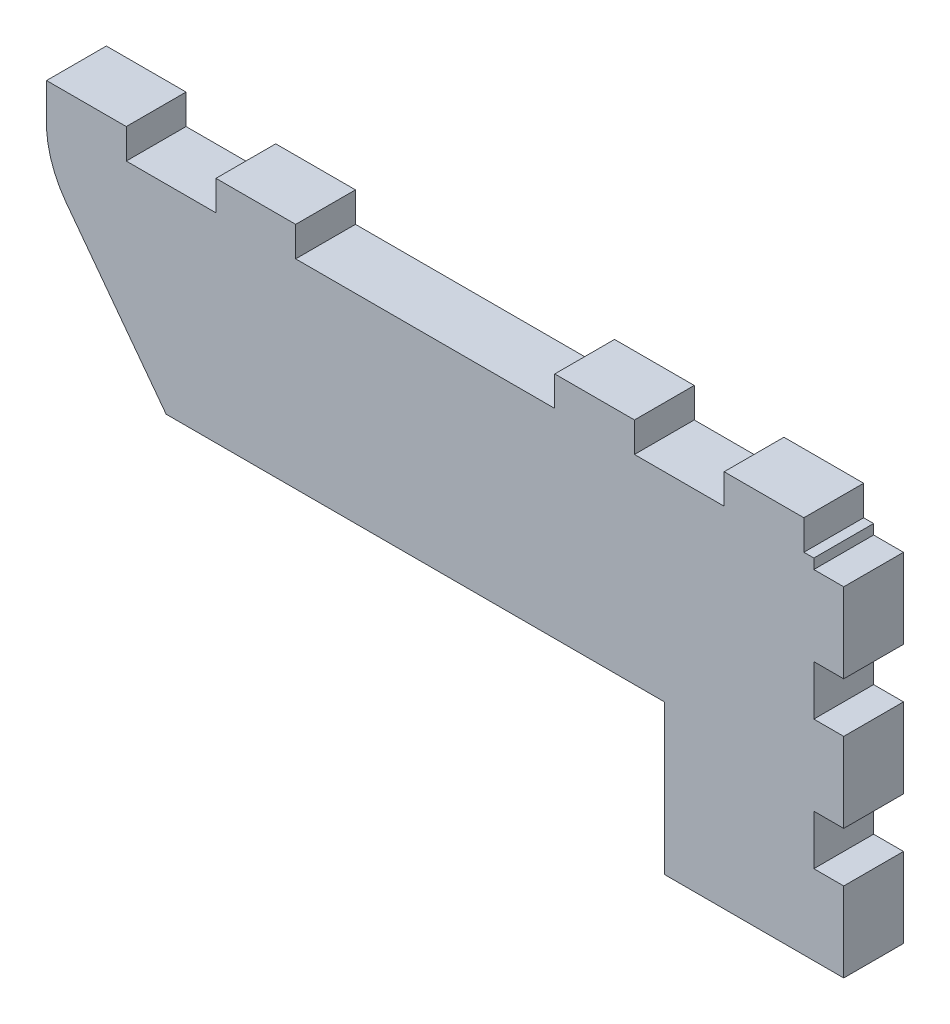
ISO-10303-21;
HEADER;
FILE_DESCRIPTION(('STEP AP214'),'2;1');
FILE_NAME('part.step','',(''),(''),'','','');
FILE_SCHEMA(('AUTOMOTIVE_DESIGN { 1 0 10303 214 1 1 1 1 }'));
ENDSEC;
DATA;
#1=APPLICATION_CONTEXT('core data for automotive mechanical design processes');
#2=APPLICATION_PROTOCOL_DEFINITION('international standard','automotive_design',2000,#1);
#3=PRODUCT_CONTEXT('',#1,'mechanical');
#4=PRODUCT('Part','Part','',(#3));
#5=PRODUCT_RELATED_PRODUCT_CATEGORY('part','',(#4));
#6=PRODUCT_DEFINITION_FORMATION('','',#4);
#7=PRODUCT_DEFINITION_CONTEXT('part definition',#1,'design');
#8=PRODUCT_DEFINITION('design','',#6,#7);
#9=PRODUCT_DEFINITION_SHAPE('','',#8);
#10=(LENGTH_UNIT() NAMED_UNIT(*) SI_UNIT(.MILLI.,.METRE.));
#11=(NAMED_UNIT(*) PLANE_ANGLE_UNIT() SI_UNIT($,.RADIAN.));
#12=(NAMED_UNIT(*) SI_UNIT($,.STERADIAN.) SOLID_ANGLE_UNIT());
#13=UNCERTAINTY_MEASURE_WITH_UNIT(LENGTH_MEASURE(1.E-05),#10,'distance_accuracy_value','');
#14=(GEOMETRIC_REPRESENTATION_CONTEXT(3) GLOBAL_UNCERTAINTY_ASSIGNED_CONTEXT((#13)) GLOBAL_UNIT_ASSIGNED_CONTEXT((#10,
#11,#12)) REPRESENTATION_CONTEXT('',''));
#15=CARTESIAN_POINT('',(0.,0.,0.));
#16=DIRECTION('',(0.,0.,1.));
#17=DIRECTION('',(1.,0.,0.));
#18=AXIS2_PLACEMENT_3D('',#15,#16,#17);
#19=CARTESIAN_POINT('',(0.,0.,6.));
#20=DIRECTION('',(0.,0.,1.));
#21=DIRECTION('',(1.,0.,0.));
#22=AXIS2_PLACEMENT_3D('',#19,#20,#21);
#23=PLANE('',#22);
#24=DIRECTION('',(-1.,0.,0.));
#25=VECTOR('',#24,1.);
#26=CARTESIAN_POINT('',(0.,35.,6.));
#27=LINE('',#26,#25);
#28=CARTESIAN_POINT('',(-26.,35.,6.));
#29=VERTEX_POINT('',#28);
#30=CARTESIAN_POINT('',(-52.,35.,6.));
#31=VERTEX_POINT('',#30);
#32=EDGE_CURVE('E433',#29,#31,#27,.T.);
#33=ORIENTED_EDGE('',*,*,#32,.T.);
#34=DIRECTION('',(0.,1.,0.));
#35=VECTOR('',#34,1.);
#36=CARTESIAN_POINT('',(-52.,0.,6.));
#37=LINE('',#36,#35);
#38=CARTESIAN_POINT('',(-52.,38.,6.));
#39=VERTEX_POINT('',#38);
#40=EDGE_CURVE('E622',#31,#39,#37,.T.);
#41=ORIENTED_EDGE('',*,*,#40,.T.);
#42=DIRECTION('',(1.,0.,0.));
#43=VECTOR('',#42,1.);
#44=CARTESIAN_POINT('',(0.,38.,6.));
#45=LINE('',#44,#43);
#46=CARTESIAN_POINT('',(-60.,38.,6.));
#47=VERTEX_POINT('',#46);
#48=EDGE_CURVE('E638',#47,#39,#45,.T.);
#49=ORIENTED_EDGE('',*,*,#48,.F.);
#50=DIRECTION('',(0.,1.,0.));
#51=VECTOR('',#50,1.);
#52=CARTESIAN_POINT('',(-60.,0.,6.));
#53=LINE('',#52,#51);
#54=CARTESIAN_POINT('',(-60.,35.,6.));
#55=VERTEX_POINT('',#54);
#56=EDGE_CURVE('E432',#55,#47,#53,.T.);
#57=ORIENTED_EDGE('',*,*,#56,.F.);
#58=CARTESIAN_POINT('',(-69.,35.,6.));
#59=VERTEX_POINT('',#58);
#60=EDGE_CURVE('E375',#55,#59,#27,.T.);
#61=ORIENTED_EDGE('',*,*,#60,.T.);
#62=DIRECTION('',(0.,1.,0.));
#63=VECTOR('',#62,1.);
#64=CARTESIAN_POINT('',(-69.,35.,6.));
#65=LINE('',#64,#63);
#66=CARTESIAN_POINT('',(-69.,38.,6.));
#67=VERTEX_POINT('',#66);
#68=EDGE_CURVE('E393',#59,#67,#65,.T.);
#69=ORIENTED_EDGE('',*,*,#68,.T.);
#70=DIRECTION('',(1.,0.,0.));
#71=VECTOR('',#70,1.);
#72=CARTESIAN_POINT('',(-77.,38.,6.));
#73=LINE('',#72,#71);
#74=CARTESIAN_POINT('',(-77.,38.,6.));
#75=VERTEX_POINT('',#74);
#76=EDGE_CURVE('E390',#75,#67,#73,.T.);
#77=ORIENTED_EDGE('',*,*,#76,.F.);
#78=DIRECTION('',(0.,1.,0.));
#79=VECTOR('',#78,1.);
#80=CARTESIAN_POINT('',(-77.,35.,6.));
#81=LINE('',#80,#79);
#82=CARTESIAN_POINT('',(-77.,35.,6.));
#83=VERTEX_POINT('',#82);
#84=EDGE_CURVE('E396',#83,#75,#81,.T.);
#85=ORIENTED_EDGE('',*,*,#84,.F.);
#86=CARTESIAN_POINT('',(-67.0204615657747,34.360615421033,6.));
#87=DIRECTION('',(0.,0.,1.));
#88=DIRECTION('',(1.,0.,0.));
#89=AXIS2_PLACEMENT_3D('',#86,#87,#88);
#90=CIRCLE('',#89,10.);
#91=CARTESIAN_POINT('',(-75.0204615657747,28.360615421033,6.));
#92=VERTEX_POINT('',#91);
#93=EDGE_CURVE('E12',#83,#92,#90,.T.);
#94=ORIENTED_EDGE('',*,*,#93,.T.);
#95=DIRECTION('',(0.6,-0.8,0.));
#96=VECTOR('',#95,1.);
#97=CARTESIAN_POINT('',(-34.4,-25.8,6.));
#98=LINE('',#97,#96);
#99=CARTESIAN_POINT('',(-65.,15.,6.));
#100=VERTEX_POINT('',#99);
#101=EDGE_CURVE('E424',#92,#100,#98,.T.);
#102=ORIENTED_EDGE('',*,*,#101,.T.);
#103=DIRECTION('',(1.,0.,0.));
#104=VECTOR('',#103,1.);
#105=CARTESIAN_POINT('',(0.,15.,6.));
#106=LINE('',#105,#104);
#107=CARTESIAN_POINT('',(-15.,15.,6.));
#108=VERTEX_POINT('',#107);
#109=EDGE_CURVE('E427',#100,#108,#106,.T.);
#110=ORIENTED_EDGE('',*,*,#109,.T.);
#111=DIRECTION('',(0.,1.,0.));
#112=VECTOR('',#111,1.);
#113=CARTESIAN_POINT('',(-15.,0.,6.));
#114=LINE('',#113,#112);
#115=CARTESIAN_POINT('',(-15.,0.,6.));
#116=VERTEX_POINT('',#115);
#117=EDGE_CURVE('E429',#116,#108,#114,.T.);
#118=ORIENTED_EDGE('',*,*,#117,.F.);
#119=DIRECTION('',(-1.,0.,0.));
#120=VECTOR('',#119,1.);
#121=CARTESIAN_POINT('',(0.,0.,6.));
#122=LINE('',#121,#120);
#123=CARTESIAN_POINT('',(3.,0.,6.));
#124=VERTEX_POINT('',#123);
#125=EDGE_CURVE('E439',#124,#116,#122,.T.);
#126=ORIENTED_EDGE('',*,*,#125,.F.);
#127=DIRECTION('',(0.,-1.,0.));
#128=VECTOR('',#127,1.);
#129=CARTESIAN_POINT('',(3.,0.,6.));
#130=LINE('',#129,#128);
#131=CARTESIAN_POINT('',(3.,8.,6.));
#132=VERTEX_POINT('',#131);
#133=EDGE_CURVE('E442',#132,#124,#130,.T.);
#134=ORIENTED_EDGE('',*,*,#133,.F.);
#135=DIRECTION('',(1.,0.,0.));
#136=VECTOR('',#135,1.);
#137=CARTESIAN_POINT('',(0.,8.,6.));
#138=LINE('',#137,#136);
#139=CARTESIAN_POINT('',(0.,8.,6.));
#140=VERTEX_POINT('',#139);
#141=EDGE_CURVE('E445',#140,#132,#138,.T.);
#142=ORIENTED_EDGE('',*,*,#141,.F.);
#143=DIRECTION('',(0.,1.,0.));
#144=VECTOR('',#143,1.);
#145=CARTESIAN_POINT('',(0.,0.,6.));
#146=LINE('',#145,#144);
#147=CARTESIAN_POINT('',(0.,13.,6.));
#148=VERTEX_POINT('',#147);
#149=EDGE_CURVE('E448',#140,#148,#146,.T.);
#150=ORIENTED_EDGE('',*,*,#149,.T.);
#151=DIRECTION('',(1.,0.,0.));
#152=VECTOR('',#151,1.);
#153=CARTESIAN_POINT('',(0.,13.,6.));
#154=LINE('',#153,#152);
#155=CARTESIAN_POINT('',(3.,13.,6.));
#156=VERTEX_POINT('',#155);
#157=EDGE_CURVE('E450',#148,#156,#154,.T.);
#158=ORIENTED_EDGE('',*,*,#157,.T.);
#159=DIRECTION('',(0.,-1.,0.));
#160=VECTOR('',#159,1.);
#161=CARTESIAN_POINT('',(3.,0.,6.));
#162=LINE('',#161,#160);
#163=CARTESIAN_POINT('',(3.,21.,6.));
#164=VERTEX_POINT('',#163);
#165=EDGE_CURVE('E453',#164,#156,#162,.T.);
#166=ORIENTED_EDGE('',*,*,#165,.F.);
#167=DIRECTION('',(1.,0.,0.));
#168=VECTOR('',#167,1.);
#169=CARTESIAN_POINT('',(0.,21.,6.));
#170=LINE('',#169,#168);
#171=CARTESIAN_POINT('',(0.,21.,6.));
#172=VERTEX_POINT('',#171);
#173=EDGE_CURVE('E456',#172,#164,#170,.T.);
#174=ORIENTED_EDGE('',*,*,#173,.F.);
#175=CARTESIAN_POINT('',(0.,26.,6.));
#176=VERTEX_POINT('',#175);
#177=EDGE_CURVE('E451',#172,#176,#146,.T.);
#178=ORIENTED_EDGE('',*,*,#177,.T.);
#179=DIRECTION('',(1.,0.,0.));
#180=VECTOR('',#179,1.);
#181=CARTESIAN_POINT('',(0.,26.,6.));
#182=LINE('',#181,#180);
#183=CARTESIAN_POINT('',(3.,26.,6.));
#184=VERTEX_POINT('',#183);
#185=EDGE_CURVE('E459',#176,#184,#182,.T.);
#186=ORIENTED_EDGE('',*,*,#185,.T.);
#187=DIRECTION('',(0.,-1.,0.));
#188=VECTOR('',#187,1.);
#189=CARTESIAN_POINT('',(3.,0.,6.));
#190=LINE('',#189,#188);
#191=CARTESIAN_POINT('',(3.,34.,6.));
#192=VERTEX_POINT('',#191);
#193=EDGE_CURVE('E461',#192,#184,#190,.T.);
#194=ORIENTED_EDGE('',*,*,#193,.F.);
#195=DIRECTION('',(1.,0.,0.));
#196=VECTOR('',#195,1.);
#197=CARTESIAN_POINT('',(0.,34.,6.));
#198=LINE('',#197,#196);
#199=CARTESIAN_POINT('',(0.,34.,6.));
#200=VERTEX_POINT('',#199);
#201=EDGE_CURVE('E464',#200,#192,#198,.T.);
#202=ORIENTED_EDGE('',*,*,#201,.F.);
#203=CARTESIAN_POINT('',(0.,35.,6.));
#204=VERTEX_POINT('',#203);
#205=EDGE_CURVE('E369',#200,#204,#146,.T.);
#206=ORIENTED_EDGE('',*,*,#205,.T.);
#207=CARTESIAN_POINT('',(-1.00000000000003,35.,6.));
#208=VERTEX_POINT('',#207);
#209=EDGE_CURVE('E364',#204,#208,#27,.T.);
#210=ORIENTED_EDGE('',*,*,#209,.T.);
#211=DIRECTION('',(0.,1.,0.));
#212=VECTOR('',#211,1.);
#213=CARTESIAN_POINT('',(-1.00000000000003,0.,6.));
#214=LINE('',#213,#212);
#215=CARTESIAN_POINT('',(-1.00000000000003,38.,6.));
#216=VERTEX_POINT('',#215);
#217=EDGE_CURVE('E353',#208,#216,#214,.T.);
#218=ORIENTED_EDGE('',*,*,#217,.T.);
#219=DIRECTION('',(1.,0.,0.));
#220=VECTOR('',#219,1.);
#221=CARTESIAN_POINT('',(0.,38.,6.));
#222=LINE('',#221,#220);
#223=CARTESIAN_POINT('',(-9.00000000000002,38.,6.));
#224=VERTEX_POINT('',#223);
#225=EDGE_CURVE('E363',#224,#216,#222,.T.);
#226=ORIENTED_EDGE('',*,*,#225,.F.);
#227=DIRECTION('',(0.,1.,0.));
#228=VECTOR('',#227,1.);
#229=CARTESIAN_POINT('',(-9.00000000000002,0.,6.));
#230=LINE('',#229,#228);
#231=CARTESIAN_POINT('',(-9.00000000000002,35.,6.));
#232=VERTEX_POINT('',#231);
#233=EDGE_CURVE('E591',#232,#224,#230,.T.);
#234=ORIENTED_EDGE('',*,*,#233,.F.);
#235=CARTESIAN_POINT('',(-18.,35.,6.));
#236=VERTEX_POINT('',#235);
#237=EDGE_CURVE('E376',#232,#236,#27,.T.);
#238=ORIENTED_EDGE('',*,*,#237,.T.);
#239=DIRECTION('',(0.,1.,0.));
#240=VECTOR('',#239,1.);
#241=CARTESIAN_POINT('',(-18.,0.,6.));
#242=LINE('',#241,#240);
#243=CARTESIAN_POINT('',(-18.,38.,6.));
#244=VERTEX_POINT('',#243);
#245=EDGE_CURVE('E634',#236,#244,#242,.T.);
#246=ORIENTED_EDGE('',*,*,#245,.T.);
#247=DIRECTION('',(1.,0.,0.));
#248=VECTOR('',#247,1.);
#249=CARTESIAN_POINT('',(0.,38.,6.));
#250=LINE('',#249,#248);
#251=CARTESIAN_POINT('',(-26.,38.,6.));
#252=VERTEX_POINT('',#251);
#253=EDGE_CURVE('E631',#252,#244,#250,.T.);
#254=ORIENTED_EDGE('',*,*,#253,.F.);
#255=DIRECTION('',(0.,1.,0.));
#256=VECTOR('',#255,1.);
#257=CARTESIAN_POINT('',(-26.,0.,6.));
#258=LINE('',#257,#256);
#259=EDGE_CURVE('E627',#29,#252,#258,.T.);
#260=ORIENTED_EDGE('',*,*,#259,.F.);
#261=EDGE_LOOP('',(#33,#41,#49,#57,#61,#69,#77,#85,#94,#102,#110,#118,#126,#134,#142,#150,#158,
#166,#174,#178,#186,#194,#202,#206,#210,#218,#226,#234,#238,#246,#254,#260));
#262=FACE_BOUND('',#261,.T.);
#263=ADVANCED_FACE('F145',(#262),#23,.T.);
#264=CARTESIAN_POINT('',(0.,0.,0.));
#265=DIRECTION('',(0.,0.,1.));
#266=DIRECTION('',(1.,0.,0.));
#267=AXIS2_PLACEMENT_3D('',#264,#265,#266);
#268=PLANE('',#267);
#269=DIRECTION('',(-1.,0.,0.));
#270=VECTOR('',#269,1.);
#271=CARTESIAN_POINT('',(0.,35.,0.));
#272=LINE('',#271,#270);
#273=CARTESIAN_POINT('',(-26.,35.,0.));
#274=VERTEX_POINT('',#273);
#275=CARTESIAN_POINT('',(-52.,35.,0.));
#276=VERTEX_POINT('',#275);
#277=EDGE_CURVE('E487',#274,#276,#272,.T.);
#278=ORIENTED_EDGE('',*,*,#277,.F.);
#279=DIRECTION('',(0.,1.,0.));
#280=VECTOR('',#279,1.);
#281=CARTESIAN_POINT('',(-26.,0.,0.));
#282=LINE('',#281,#280);
#283=CARTESIAN_POINT('',(-26.,38.,0.));
#284=VERTEX_POINT('',#283);
#285=EDGE_CURVE('E484',#274,#284,#282,.T.);
#286=ORIENTED_EDGE('',*,*,#285,.T.);
#287=DIRECTION('',(1.,0.,0.));
#288=VECTOR('',#287,1.);
#289=CARTESIAN_POINT('',(0.,38.,0.));
#290=LINE('',#289,#288);
#291=CARTESIAN_POINT('',(-18.,38.,0.));
#292=VERTEX_POINT('',#291);
#293=EDGE_CURVE('E481',#284,#292,#290,.T.);
#294=ORIENTED_EDGE('',*,*,#293,.T.);
#295=DIRECTION('',(0.,1.,0.));
#296=VECTOR('',#295,1.);
#297=CARTESIAN_POINT('',(-18.,0.,0.));
#298=LINE('',#297,#296);
#299=CARTESIAN_POINT('',(-18.,35.,0.));
#300=VERTEX_POINT('',#299);
#301=EDGE_CURVE('E478',#300,#292,#298,.T.);
#302=ORIENTED_EDGE('',*,*,#301,.F.);
#303=CARTESIAN_POINT('',(-9.00000000000002,35.,0.));
#304=VERTEX_POINT('',#303);
#305=EDGE_CURVE('E470',#304,#300,#272,.T.);
#306=ORIENTED_EDGE('',*,*,#305,.F.);
#307=DIRECTION('',(0.,1.,0.));
#308=VECTOR('',#307,1.);
#309=CARTESIAN_POINT('',(-9.00000000000002,0.,0.));
#310=LINE('',#309,#308);
#311=CARTESIAN_POINT('',(-9.00000000000002,38.,0.));
#312=VERTEX_POINT('',#311);
#313=EDGE_CURVE('E475',#304,#312,#310,.T.);
#314=ORIENTED_EDGE('',*,*,#313,.T.);
#315=DIRECTION('',(1.,0.,0.));
#316=VECTOR('',#315,1.);
#317=CARTESIAN_POINT('',(0.,38.,0.));
#318=LINE('',#317,#316);
#319=CARTESIAN_POINT('',(-1.00000000000003,38.,0.));
#320=VERTEX_POINT('',#319);
#321=EDGE_CURVE('E472',#312,#320,#318,.T.);
#322=ORIENTED_EDGE('',*,*,#321,.T.);
#323=DIRECTION('',(0.,1.,0.));
#324=VECTOR('',#323,1.);
#325=CARTESIAN_POINT('',(-1.00000000000003,0.,0.));
#326=LINE('',#325,#324);
#327=CARTESIAN_POINT('',(-1.00000000000003,35.,0.));
#328=VERTEX_POINT('',#327);
#329=EDGE_CURVE('E468',#328,#320,#326,.T.);
#330=ORIENTED_EDGE('',*,*,#329,.F.);
#331=CARTESIAN_POINT('',(0.,35.,0.));
#332=VERTEX_POINT('',#331);
#333=EDGE_CURVE('E379',#332,#328,#272,.T.);
#334=ORIENTED_EDGE('',*,*,#333,.F.);
#335=DIRECTION('',(0.,1.,0.));
#336=VECTOR('',#335,1.);
#337=CARTESIAN_POINT('',(0.,0.,0.));
#338=LINE('',#337,#336);
#339=CARTESIAN_POINT('',(0.,34.,0.));
#340=VERTEX_POINT('',#339);
#341=EDGE_CURVE('E373',#340,#332,#338,.T.);
#342=ORIENTED_EDGE('',*,*,#341,.F.);
#343=DIRECTION('',(1.,0.,0.));
#344=VECTOR('',#343,1.);
#345=CARTESIAN_POINT('',(0.,34.,0.));
#346=LINE('',#345,#344);
#347=CARTESIAN_POINT('',(3.,34.,0.));
#348=VERTEX_POINT('',#347);
#349=EDGE_CURVE('E531',#340,#348,#346,.T.);
#350=ORIENTED_EDGE('',*,*,#349,.T.);
#351=DIRECTION('',(0.,-1.,0.));
#352=VECTOR('',#351,1.);
#353=CARTESIAN_POINT('',(3.,0.,0.));
#354=LINE('',#353,#352);
#355=CARTESIAN_POINT('',(3.,26.,0.));
#356=VERTEX_POINT('',#355);
#357=EDGE_CURVE('E528',#348,#356,#354,.T.);
#358=ORIENTED_EDGE('',*,*,#357,.T.);
#359=DIRECTION('',(1.,0.,0.));
#360=VECTOR('',#359,1.);
#361=CARTESIAN_POINT('',(0.,26.,0.));
#362=LINE('',#361,#360);
#363=CARTESIAN_POINT('',(0.,26.,0.));
#364=VERTEX_POINT('',#363);
#365=EDGE_CURVE('E525',#364,#356,#362,.T.);
#366=ORIENTED_EDGE('',*,*,#365,.F.);
#367=CARTESIAN_POINT('',(0.,21.,0.));
#368=VERTEX_POINT('',#367);
#369=EDGE_CURVE('E516',#368,#364,#338,.T.);
#370=ORIENTED_EDGE('',*,*,#369,.F.);
#371=DIRECTION('',(1.,0.,0.));
#372=VECTOR('',#371,1.);
#373=CARTESIAN_POINT('',(0.,21.,0.));
#374=LINE('',#373,#372);
#375=CARTESIAN_POINT('',(3.,21.,0.));
#376=VERTEX_POINT('',#375);
#377=EDGE_CURVE('E522',#368,#376,#374,.T.);
#378=ORIENTED_EDGE('',*,*,#377,.T.);
#379=DIRECTION('',(0.,-1.,0.));
#380=VECTOR('',#379,1.);
#381=CARTESIAN_POINT('',(3.,0.,0.));
#382=LINE('',#381,#380);
#383=CARTESIAN_POINT('',(3.,13.,0.));
#384=VERTEX_POINT('',#383);
#385=EDGE_CURVE('E519',#376,#384,#382,.T.);
#386=ORIENTED_EDGE('',*,*,#385,.T.);
#387=DIRECTION('',(1.,0.,0.));
#388=VECTOR('',#387,1.);
#389=CARTESIAN_POINT('',(0.,13.,0.));
#390=LINE('',#389,#388);
#391=CARTESIAN_POINT('',(0.,13.,0.));
#392=VERTEX_POINT('',#391);
#393=EDGE_CURVE('E515',#392,#384,#390,.T.);
#394=ORIENTED_EDGE('',*,*,#393,.F.);
#395=CARTESIAN_POINT('',(0.,8.,0.));
#396=VERTEX_POINT('',#395);
#397=EDGE_CURVE('E513',#396,#392,#338,.T.);
#398=ORIENTED_EDGE('',*,*,#397,.F.);
#399=DIRECTION('',(1.,0.,0.));
#400=VECTOR('',#399,1.);
#401=CARTESIAN_POINT('',(0.,8.,0.));
#402=LINE('',#401,#400);
#403=CARTESIAN_POINT('',(3.,8.,0.));
#404=VERTEX_POINT('',#403);
#405=EDGE_CURVE('E510',#396,#404,#402,.T.);
#406=ORIENTED_EDGE('',*,*,#405,.T.);
#407=DIRECTION('',(0.,-1.,0.));
#408=VECTOR('',#407,1.);
#409=CARTESIAN_POINT('',(3.,0.,0.));
#410=LINE('',#409,#408);
#411=CARTESIAN_POINT('',(3.,0.,0.));
#412=VERTEX_POINT('',#411);
#413=EDGE_CURVE('E507',#404,#412,#410,.T.);
#414=ORIENTED_EDGE('',*,*,#413,.T.);
#415=DIRECTION('',(-1.,0.,0.));
#416=VECTOR('',#415,1.);
#417=CARTESIAN_POINT('',(0.,0.,0.));
#418=LINE('',#417,#416);
#419=CARTESIAN_POINT('',(-15.,0.,0.));
#420=VERTEX_POINT('',#419);
#421=EDGE_CURVE('E504',#412,#420,#418,.T.);
#422=ORIENTED_EDGE('',*,*,#421,.T.);
#423=DIRECTION('',(0.,1.,0.));
#424=VECTOR('',#423,1.);
#425=CARTESIAN_POINT('',(-15.,0.,0.));
#426=LINE('',#425,#424);
#427=CARTESIAN_POINT('',(-15.,15.,0.));
#428=VERTEX_POINT('',#427);
#429=EDGE_CURVE('E501',#420,#428,#426,.T.);
#430=ORIENTED_EDGE('',*,*,#429,.T.);
#431=DIRECTION('',(1.,0.,0.));
#432=VECTOR('',#431,1.);
#433=CARTESIAN_POINT('',(0.,15.,0.));
#434=LINE('',#433,#432);
#435=CARTESIAN_POINT('',(-65.,15.,0.));
#436=VERTEX_POINT('',#435);
#437=EDGE_CURVE('E498',#436,#428,#434,.T.);
#438=ORIENTED_EDGE('',*,*,#437,.F.);
#439=DIRECTION('',(0.6,-0.8,0.));
#440=VECTOR('',#439,1.);
#441=CARTESIAN_POINT('',(-34.4,-25.8,0.));
#442=LINE('',#441,#440);
#443=CARTESIAN_POINT('',(-75.0204615657747,28.360615421033,0.));
#444=VERTEX_POINT('',#443);
#445=EDGE_CURVE('E416',#444,#436,#442,.T.);
#446=ORIENTED_EDGE('',*,*,#445,.F.);
#447=CARTESIAN_POINT('',(-67.0204615657747,34.360615421033,0.));
#448=DIRECTION('',(0.,0.,1.));
#449=DIRECTION('',(1.,0.,0.));
#450=AXIS2_PLACEMENT_3D('',#447,#448,#449);
#451=CIRCLE('',#450,10.);
#452=CARTESIAN_POINT('',(-77.,35.,0.));
#453=VERTEX_POINT('',#452);
#454=EDGE_CURVE('E153',#444,#453,#451,.F.);
#455=ORIENTED_EDGE('',*,*,#454,.T.);
#456=DIRECTION('',(0.,1.,0.));
#457=VECTOR('',#456,1.);
#458=CARTESIAN_POINT('',(-77.,35.,0.));
#459=LINE('',#458,#457);
#460=CARTESIAN_POINT('',(-77.,38.,0.));
#461=VERTEX_POINT('',#460);
#462=EDGE_CURVE('E394',#453,#461,#459,.T.);
#463=ORIENTED_EDGE('',*,*,#462,.T.);
#464=DIRECTION('',(1.,0.,0.));
#465=VECTOR('',#464,1.);
#466=CARTESIAN_POINT('',(-77.,38.,0.));
#467=LINE('',#466,#465);
#468=CARTESIAN_POINT('',(-69.,38.,0.));
#469=VERTEX_POINT('',#468);
#470=EDGE_CURVE('E400',#461,#469,#467,.T.);
#471=ORIENTED_EDGE('',*,*,#470,.T.);
#472=DIRECTION('',(0.,1.,0.));
#473=VECTOR('',#472,1.);
#474=CARTESIAN_POINT('',(-69.,35.,0.));
#475=LINE('',#474,#473);
#476=CARTESIAN_POINT('',(-69.,35.,0.));
#477=VERTEX_POINT('',#476);
#478=EDGE_CURVE('E403',#477,#469,#475,.T.);
#479=ORIENTED_EDGE('',*,*,#478,.F.);
#480=CARTESIAN_POINT('',(-60.,35.,0.));
#481=VERTEX_POINT('',#480);
#482=EDGE_CURVE('E469',#481,#477,#272,.T.);
#483=ORIENTED_EDGE('',*,*,#482,.F.);
#484=DIRECTION('',(0.,1.,0.));
#485=VECTOR('',#484,1.);
#486=CARTESIAN_POINT('',(-60.,0.,0.));
#487=LINE('',#486,#485);
#488=CARTESIAN_POINT('',(-60.,38.,0.));
#489=VERTEX_POINT('',#488);
#490=EDGE_CURVE('E494',#481,#489,#487,.T.);
#491=ORIENTED_EDGE('',*,*,#490,.T.);
#492=DIRECTION('',(1.,0.,0.));
#493=VECTOR('',#492,1.);
#494=CARTESIAN_POINT('',(0.,38.,0.));
#495=LINE('',#494,#493);
#496=CARTESIAN_POINT('',(-52.,38.,0.));
#497=VERTEX_POINT('',#496);
#498=EDGE_CURVE('E491',#489,#497,#495,.T.);
#499=ORIENTED_EDGE('',*,*,#498,.T.);
#500=DIRECTION('',(0.,1.,0.));
#501=VECTOR('',#500,1.);
#502=CARTESIAN_POINT('',(-52.,0.,0.));
#503=LINE('',#502,#501);
#504=EDGE_CURVE('E488',#276,#497,#503,.T.);
#505=ORIENTED_EDGE('',*,*,#504,.F.);
#506=EDGE_LOOP('',(#278,#286,#294,#302,#306,#314,#322,#330,#334,#342,#350,#358,#366,#370,#378,
#386,#394,#398,#406,#414,#422,#430,#438,#446,#455,#463,#471,#479,#483,#491,#499,#505));
#507=FACE_BOUND('',#506,.T.);
#508=ADVANCED_FACE('F414',(#507),#268,.F.);
#509=CARTESIAN_POINT('',(0.,35.,6.));
#510=DIRECTION('',(0.,-1.,0.));
#511=DIRECTION('',(1.,0.,0.));
#512=AXIS2_PLACEMENT_3D('',#509,#510,#511);
#513=PLANE('',#512);
#514=DIRECTION('',(0.,0.,-1.));
#515=VECTOR('',#514,1.);
#516=CARTESIAN_POINT('',(-69.,35.,6.));
#517=LINE('',#516,#515);
#518=EDGE_CURVE('E380',#59,#477,#517,.T.);
#519=ORIENTED_EDGE('',*,*,#518,.F.);
#520=ORIENTED_EDGE('',*,*,#60,.F.);
#521=DIRECTION('',(0.,0.,-1.));
#522=VECTOR('',#521,1.);
#523=CARTESIAN_POINT('',(-60.,35.,6.));
#524=LINE('',#523,#522);
#525=EDGE_CURVE('E565',#55,#481,#524,.T.);
#526=ORIENTED_EDGE('',*,*,#525,.T.);
#527=ORIENTED_EDGE('',*,*,#482,.T.);
#528=EDGE_LOOP('',(#519,#520,#526,#527));
#529=FACE_BOUND('',#528,.T.);
#530=ADVANCED_FACE('F603',(#529),#513,.F.);
#531=ORIENTED_EDGE('',*,*,#333,.T.);
#532=DIRECTION('',(0.,0.,-1.));
#533=VECTOR('',#532,1.);
#534=CARTESIAN_POINT('',(-1.00000000000003,35.,6.));
#535=LINE('',#534,#533);
#536=EDGE_CURVE('E358',#208,#328,#535,.T.);
#537=ORIENTED_EDGE('',*,*,#536,.F.);
#538=ORIENTED_EDGE('',*,*,#209,.F.);
#539=DIRECTION('',(0.,0.,-1.));
#540=VECTOR('',#539,1.);
#541=CARTESIAN_POINT('',(0.,35.,6.));
#542=LINE('',#541,#540);
#543=EDGE_CURVE('E534',#204,#332,#542,.T.);
#544=ORIENTED_EDGE('',*,*,#543,.T.);
#545=EDGE_LOOP('',(#531,#537,#538,#544));
#546=FACE_BOUND('',#545,.T.);
#547=ADVANCED_FACE('F377',(#546),#513,.F.);
#548=CARTESIAN_POINT('',(-1.00000000000003,0.,6.));
#549=DIRECTION('',(-1.,0.,0.));
#550=DIRECTION('',(0.,0.,1.));
#551=AXIS2_PLACEMENT_3D('',#548,#549,#550);
#552=PLANE('',#551);
#553=ORIENTED_EDGE('',*,*,#329,.T.);
#554=DIRECTION('',(0.,0.,-1.));
#555=VECTOR('',#554,1.);
#556=CARTESIAN_POINT('',(-1.00000000000003,38.,6.));
#557=LINE('',#556,#555);
#558=EDGE_CURVE('E360',#216,#320,#557,.T.);
#559=ORIENTED_EDGE('',*,*,#558,.F.);
#560=ORIENTED_EDGE('',*,*,#217,.F.);
#561=ORIENTED_EDGE('',*,*,#536,.T.);
#562=EDGE_LOOP('',(#553,#559,#560,#561));
#563=FACE_BOUND('',#562,.T.);
#564=ADVANCED_FACE('F356',(#563),#552,.F.);
#565=CARTESIAN_POINT('',(0.,38.,6.));
#566=DIRECTION('',(0.,1.,0.));
#567=DIRECTION('',(0.,0.,1.));
#568=AXIS2_PLACEMENT_3D('',#565,#566,#567);
#569=PLANE('',#568);
#570=ORIENTED_EDGE('',*,*,#321,.F.);
#571=DIRECTION('',(0.,0.,-1.));
#572=VECTOR('',#571,1.);
#573=CARTESIAN_POINT('',(-9.00000000000002,38.,6.));
#574=LINE('',#573,#572);
#575=EDGE_CURVE('E384',#224,#312,#574,.T.);
#576=ORIENTED_EDGE('',*,*,#575,.F.);
#577=ORIENTED_EDGE('',*,*,#225,.T.);
#578=ORIENTED_EDGE('',*,*,#558,.T.);
#579=EDGE_LOOP('',(#570,#576,#577,#578));
#580=FACE_BOUND('',#579,.T.);
#581=ADVANCED_FACE('F593',(#580),#569,.T.);
#582=CARTESIAN_POINT('',(-9.00000000000002,0.,6.));
#583=DIRECTION('',(-1.,0.,0.));
#584=DIRECTION('',(0.,0.,1.));
#585=AXIS2_PLACEMENT_3D('',#582,#583,#584);
#586=PLANE('',#585);
#587=ORIENTED_EDGE('',*,*,#313,.F.);
#588=DIRECTION('',(0.,0.,-1.));
#589=VECTOR('',#588,1.);
#590=CARTESIAN_POINT('',(-9.00000000000002,35.,6.));
#591=LINE('',#590,#589);
#592=EDGE_CURVE('E584',#232,#304,#591,.T.);
#593=ORIENTED_EDGE('',*,*,#592,.F.);
#594=ORIENTED_EDGE('',*,*,#233,.T.);
#595=ORIENTED_EDGE('',*,*,#575,.T.);
#596=EDGE_LOOP('',(#587,#593,#594,#595));
#597=FACE_BOUND('',#596,.T.);
#598=ADVANCED_FACE('F589',(#597),#586,.T.);
#599=ORIENTED_EDGE('',*,*,#305,.T.);
#600=DIRECTION('',(0.,0.,-1.));
#601=VECTOR('',#600,1.);
#602=CARTESIAN_POINT('',(-18.,35.,6.));
#603=LINE('',#602,#601);
#604=EDGE_CURVE('E581',#236,#300,#603,.T.);
#605=ORIENTED_EDGE('',*,*,#604,.F.);
#606=ORIENTED_EDGE('',*,*,#237,.F.);
#607=ORIENTED_EDGE('',*,*,#592,.T.);
#608=EDGE_LOOP('',(#599,#605,#606,#607));
#609=FACE_BOUND('',#608,.T.);
#610=ADVANCED_FACE('F730',(#609),#513,.F.);
#611=CARTESIAN_POINT('',(-18.,0.,6.));
#612=DIRECTION('',(-1.,0.,0.));
#613=DIRECTION('',(0.,0.,1.));
#614=AXIS2_PLACEMENT_3D('',#611,#612,#613);
#615=PLANE('',#614);
#616=ORIENTED_EDGE('',*,*,#301,.T.);
#617=DIRECTION('',(0.,0.,-1.));
#618=VECTOR('',#617,1.);
#619=CARTESIAN_POINT('',(-18.,38.,6.));
#620=LINE('',#619,#618);
#621=EDGE_CURVE('E579',#244,#292,#620,.T.);
#622=ORIENTED_EDGE('',*,*,#621,.F.);
#623=ORIENTED_EDGE('',*,*,#245,.F.);
#624=ORIENTED_EDGE('',*,*,#604,.T.);
#625=EDGE_LOOP('',(#616,#622,#623,#624));
#626=FACE_BOUND('',#625,.T.);
#627=ADVANCED_FACE('F726',(#626),#615,.F.);
#628=CARTESIAN_POINT('',(0.,38.,6.));
#629=DIRECTION('',(0.,1.,0.));
#630=DIRECTION('',(0.,0.,1.));
#631=AXIS2_PLACEMENT_3D('',#628,#629,#630);
#632=PLANE('',#631);
#633=ORIENTED_EDGE('',*,*,#293,.F.);
#634=DIRECTION('',(0.,0.,-1.));
#635=VECTOR('',#634,1.);
#636=CARTESIAN_POINT('',(-26.,38.,6.));
#637=LINE('',#636,#635);
#638=EDGE_CURVE('E577',#252,#284,#637,.T.);
#639=ORIENTED_EDGE('',*,*,#638,.F.);
#640=ORIENTED_EDGE('',*,*,#253,.T.);
#641=ORIENTED_EDGE('',*,*,#621,.T.);
#642=EDGE_LOOP('',(#633,#639,#640,#641));
#643=FACE_BOUND('',#642,.T.);
#644=ADVANCED_FACE('F723',(#643),#632,.T.);
#645=CARTESIAN_POINT('',(-26.,0.,6.));
#646=DIRECTION('',(-1.,0.,0.));
#647=DIRECTION('',(0.,0.,1.));
#648=AXIS2_PLACEMENT_3D('',#645,#646,#647);
#649=PLANE('',#648);
#650=ORIENTED_EDGE('',*,*,#285,.F.);
#651=DIRECTION('',(0.,0.,-1.));
#652=VECTOR('',#651,1.);
#653=CARTESIAN_POINT('',(-26.,35.,6.));
#654=LINE('',#653,#652);
#655=EDGE_CURVE('E574',#29,#274,#654,.T.);
#656=ORIENTED_EDGE('',*,*,#655,.F.);
#657=ORIENTED_EDGE('',*,*,#259,.T.);
#658=ORIENTED_EDGE('',*,*,#638,.T.);
#659=EDGE_LOOP('',(#650,#656,#657,#658));
#660=FACE_BOUND('',#659,.T.);
#661=ADVANCED_FACE('F720',(#660),#649,.T.);
#662=ORIENTED_EDGE('',*,*,#277,.T.);
#663=DIRECTION('',(0.,0.,-1.));
#664=VECTOR('',#663,1.);
#665=CARTESIAN_POINT('',(-52.,35.,6.));
#666=LINE('',#665,#664);
#667=EDGE_CURVE('E571',#31,#276,#666,.T.);
#668=ORIENTED_EDGE('',*,*,#667,.F.);
#669=ORIENTED_EDGE('',*,*,#32,.F.);
#670=ORIENTED_EDGE('',*,*,#655,.T.);
#671=EDGE_LOOP('',(#662,#668,#669,#670));
#672=FACE_BOUND('',#671,.T.);
#673=ADVANCED_FACE('F624',(#672),#513,.F.);
#674=CARTESIAN_POINT('',(-52.,0.,6.));
#675=DIRECTION('',(-1.,0.,0.));
#676=DIRECTION('',(0.,0.,1.));
#677=AXIS2_PLACEMENT_3D('',#674,#675,#676);
#678=PLANE('',#677);
#679=ORIENTED_EDGE('',*,*,#504,.T.);
#680=DIRECTION('',(0.,0.,-1.));
#681=VECTOR('',#680,1.);
#682=CARTESIAN_POINT('',(-52.,38.,6.));
#683=LINE('',#682,#681);
#684=EDGE_CURVE('E569',#39,#497,#683,.T.);
#685=ORIENTED_EDGE('',*,*,#684,.F.);
#686=ORIENTED_EDGE('',*,*,#40,.F.);
#687=ORIENTED_EDGE('',*,*,#667,.T.);
#688=EDGE_LOOP('',(#679,#685,#686,#687));
#689=FACE_BOUND('',#688,.T.);
#690=ADVANCED_FACE('F620',(#689),#678,.F.);
#691=CARTESIAN_POINT('',(0.,38.,6.));
#692=DIRECTION('',(0.,1.,0.));
#693=DIRECTION('',(0.,0.,1.));
#694=AXIS2_PLACEMENT_3D('',#691,#692,#693);
#695=PLANE('',#694);
#696=ORIENTED_EDGE('',*,*,#498,.F.);
#697=DIRECTION('',(0.,0.,-1.));
#698=VECTOR('',#697,1.);
#699=CARTESIAN_POINT('',(-60.,38.,6.));
#700=LINE('',#699,#698);
#701=EDGE_CURVE('E567',#47,#489,#700,.T.);
#702=ORIENTED_EDGE('',*,*,#701,.F.);
#703=ORIENTED_EDGE('',*,*,#48,.T.);
#704=ORIENTED_EDGE('',*,*,#684,.T.);
#705=EDGE_LOOP('',(#696,#702,#703,#704));
#706=FACE_BOUND('',#705,.T.);
#707=ADVANCED_FACE('F616',(#706),#695,.T.);
#708=CARTESIAN_POINT('',(-60.,0.,6.));
#709=DIRECTION('',(-1.,0.,0.));
#710=DIRECTION('',(0.,0.,1.));
#711=AXIS2_PLACEMENT_3D('',#708,#709,#710);
#712=PLANE('',#711);
#713=ORIENTED_EDGE('',*,*,#490,.F.);
#714=ORIENTED_EDGE('',*,*,#525,.F.);
#715=ORIENTED_EDGE('',*,*,#56,.T.);
#716=ORIENTED_EDGE('',*,*,#701,.T.);
#717=EDGE_LOOP('',(#713,#714,#715,#716));
#718=FACE_BOUND('',#717,.T.);
#719=ADVANCED_FACE('F609',(#718),#712,.T.);
#720=CARTESIAN_POINT('',(-34.4,-25.8,6.));
#721=DIRECTION('',(0.8,0.6,0.));
#722=DIRECTION('',(-0.6,0.8,0.));
#723=AXIS2_PLACEMENT_3D('',#720,#721,#722);
#724=PLANE('',#723);
#725=ORIENTED_EDGE('',*,*,#101,.F.);
#726=DIRECTION('',(0.,0.,-1.));
#727=VECTOR('',#726,1.);
#728=CARTESIAN_POINT('',(-75.0204615657747,28.360615421033,6.));
#729=LINE('',#728,#727);
#730=EDGE_CURVE('E389',#92,#444,#729,.T.);
#731=ORIENTED_EDGE('',*,*,#730,.T.);
#732=ORIENTED_EDGE('',*,*,#445,.T.);
#733=DIRECTION('',(0.,0.,-1.));
#734=VECTOR('',#733,1.);
#735=CARTESIAN_POINT('',(-65.,15.,6.));
#736=LINE('',#735,#734);
#737=EDGE_CURVE('E425',#100,#436,#736,.T.);
#738=ORIENTED_EDGE('',*,*,#737,.F.);
#739=EDGE_LOOP('',(#725,#731,#732,#738));
#740=FACE_BOUND('',#739,.T.);
#741=ADVANCED_FACE('F421',(#740),#724,.F.);
#742=CARTESIAN_POINT('',(0.,15.,6.));
#743=DIRECTION('',(0.,1.,0.));
#744=DIRECTION('',(0.,0.,1.));
#745=AXIS2_PLACEMENT_3D('',#742,#743,#744);
#746=PLANE('',#745);
#747=ORIENTED_EDGE('',*,*,#437,.T.);
#748=DIRECTION('',(0.,0.,-1.));
#749=VECTOR('',#748,1.);
#750=CARTESIAN_POINT('',(-15.,15.,6.));
#751=LINE('',#750,#749);
#752=EDGE_CURVE('E562',#108,#428,#751,.T.);
#753=ORIENTED_EDGE('',*,*,#752,.F.);
#754=ORIENTED_EDGE('',*,*,#109,.F.);
#755=ORIENTED_EDGE('',*,*,#737,.T.);
#756=EDGE_LOOP('',(#747,#753,#754,#755));
#757=FACE_BOUND('',#756,.T.);
#758=ADVANCED_FACE('F705',(#757),#746,.F.);
#759=CARTESIAN_POINT('',(-15.,0.,6.));
#760=DIRECTION('',(-1.,0.,0.));
#761=DIRECTION('',(0.,0.,1.));
#762=AXIS2_PLACEMENT_3D('',#759,#760,#761);
#763=PLANE('',#762);
#764=ORIENTED_EDGE('',*,*,#429,.F.);
#765=DIRECTION('',(0.,0.,-1.));
#766=VECTOR('',#765,1.);
#767=CARTESIAN_POINT('',(-15.,0.,6.));
#768=LINE('',#767,#766);
#769=EDGE_CURVE('E560',#116,#420,#768,.T.);
#770=ORIENTED_EDGE('',*,*,#769,.F.);
#771=ORIENTED_EDGE('',*,*,#117,.T.);
#772=ORIENTED_EDGE('',*,*,#752,.T.);
#773=EDGE_LOOP('',(#764,#770,#771,#772));
#774=FACE_BOUND('',#773,.T.);
#775=ADVANCED_FACE('F701',(#774),#763,.T.);
#776=CARTESIAN_POINT('',(0.,0.,6.));
#777=DIRECTION('',(0.,-1.,0.));
#778=DIRECTION('',(1.,0.,0.));
#779=AXIS2_PLACEMENT_3D('',#776,#777,#778);
#780=PLANE('',#779);
#781=ORIENTED_EDGE('',*,*,#421,.F.);
#782=DIRECTION('',(0.,0.,-1.));
#783=VECTOR('',#782,1.);
#784=CARTESIAN_POINT('',(3.,0.,6.));
#785=LINE('',#784,#783);
#786=EDGE_CURVE('E558',#124,#412,#785,.T.);
#787=ORIENTED_EDGE('',*,*,#786,.F.);
#788=ORIENTED_EDGE('',*,*,#125,.T.);
#789=ORIENTED_EDGE('',*,*,#769,.T.);
#790=EDGE_LOOP('',(#781,#787,#788,#789));
#791=FACE_BOUND('',#790,.T.);
#792=ADVANCED_FACE('F697',(#791),#780,.T.);
#793=CARTESIAN_POINT('',(3.,0.,6.));
#794=DIRECTION('',(1.,0.,0.));
#795=DIRECTION('',(0.,1.,0.));
#796=AXIS2_PLACEMENT_3D('',#793,#794,#795);
#797=PLANE('',#796);
#798=ORIENTED_EDGE('',*,*,#413,.F.);
#799=DIRECTION('',(0.,0.,-1.));
#800=VECTOR('',#799,1.);
#801=CARTESIAN_POINT('',(3.,8.,6.));
#802=LINE('',#801,#800);
#803=EDGE_CURVE('E556',#132,#404,#802,.T.);
#804=ORIENTED_EDGE('',*,*,#803,.F.);
#805=ORIENTED_EDGE('',*,*,#133,.T.);
#806=ORIENTED_EDGE('',*,*,#786,.T.);
#807=EDGE_LOOP('',(#798,#804,#805,#806));
#808=FACE_BOUND('',#807,.T.);
#809=ADVANCED_FACE('F693',(#808),#797,.T.);
#810=CARTESIAN_POINT('',(0.,8.,6.));
#811=DIRECTION('',(0.,1.,0.));
#812=DIRECTION('',(0.,0.,1.));
#813=AXIS2_PLACEMENT_3D('',#810,#811,#812);
#814=PLANE('',#813);
#815=ORIENTED_EDGE('',*,*,#405,.F.);
#816=DIRECTION('',(0.,0.,-1.));
#817=VECTOR('',#816,1.);
#818=CARTESIAN_POINT('',(0.,8.,6.));
#819=LINE('',#818,#817);
#820=EDGE_CURVE('E554',#140,#396,#819,.T.);
#821=ORIENTED_EDGE('',*,*,#820,.F.);
#822=ORIENTED_EDGE('',*,*,#141,.T.);
#823=ORIENTED_EDGE('',*,*,#803,.T.);
#824=EDGE_LOOP('',(#815,#821,#822,#823));
#825=FACE_BOUND('',#824,.T.);
#826=ADVANCED_FACE('F690',(#825),#814,.T.);
#827=CARTESIAN_POINT('',(0.,0.,6.));
#828=DIRECTION('',(-1.,0.,0.));
#829=DIRECTION('',(0.,0.,1.));
#830=AXIS2_PLACEMENT_3D('',#827,#828,#829);
#831=PLANE('',#830);
#832=ORIENTED_EDGE('',*,*,#397,.T.);
#833=DIRECTION('',(0.,0.,-1.));
#834=VECTOR('',#833,1.);
#835=CARTESIAN_POINT('',(0.,13.,6.));
#836=LINE('',#835,#834);
#837=EDGE_CURVE('E551',#148,#392,#836,.T.);
#838=ORIENTED_EDGE('',*,*,#837,.F.);
#839=ORIENTED_EDGE('',*,*,#149,.F.);
#840=ORIENTED_EDGE('',*,*,#820,.T.);
#841=EDGE_LOOP('',(#832,#838,#839,#840));
#842=FACE_BOUND('',#841,.T.);
#843=ADVANCED_FACE('F665',(#842),#831,.F.);
#844=CARTESIAN_POINT('',(0.,13.,6.));
#845=DIRECTION('',(0.,1.,0.));
#846=DIRECTION('',(0.,0.,1.));
#847=AXIS2_PLACEMENT_3D('',#844,#845,#846);
#848=PLANE('',#847);
#849=ORIENTED_EDGE('',*,*,#393,.T.);
#850=DIRECTION('',(0.,0.,-1.));
#851=VECTOR('',#850,1.);
#852=CARTESIAN_POINT('',(3.,13.,6.));
#853=LINE('',#852,#851);
#854=EDGE_CURVE('E549',#156,#384,#853,.T.);
#855=ORIENTED_EDGE('',*,*,#854,.F.);
#856=ORIENTED_EDGE('',*,*,#157,.F.);
#857=ORIENTED_EDGE('',*,*,#837,.T.);
#858=EDGE_LOOP('',(#849,#855,#856,#857));
#859=FACE_BOUND('',#858,.T.);
#860=ADVANCED_FACE('F685',(#859),#848,.F.);
#861=CARTESIAN_POINT('',(3.,0.,6.));
#862=DIRECTION('',(1.,0.,0.));
#863=DIRECTION('',(0.,1.,0.));
#864=AXIS2_PLACEMENT_3D('',#861,#862,#863);
#865=PLANE('',#864);
#866=ORIENTED_EDGE('',*,*,#385,.F.);
#867=DIRECTION('',(0.,0.,-1.));
#868=VECTOR('',#867,1.);
#869=CARTESIAN_POINT('',(3.,21.,6.));
#870=LINE('',#869,#868);
#871=EDGE_CURVE('E547',#164,#376,#870,.T.);
#872=ORIENTED_EDGE('',*,*,#871,.F.);
#873=ORIENTED_EDGE('',*,*,#165,.T.);
#874=ORIENTED_EDGE('',*,*,#854,.T.);
#875=EDGE_LOOP('',(#866,#872,#873,#874));
#876=FACE_BOUND('',#875,.T.);
#877=ADVANCED_FACE('F681',(#876),#865,.T.);
#878=CARTESIAN_POINT('',(0.,21.,6.));
#879=DIRECTION('',(0.,1.,0.));
#880=DIRECTION('',(0.,0.,1.));
#881=AXIS2_PLACEMENT_3D('',#878,#879,#880);
#882=PLANE('',#881);
#883=ORIENTED_EDGE('',*,*,#377,.F.);
#884=DIRECTION('',(0.,0.,-1.));
#885=VECTOR('',#884,1.);
#886=CARTESIAN_POINT('',(0.,21.,6.));
#887=LINE('',#886,#885);
#888=EDGE_CURVE('E545',#172,#368,#887,.T.);
#889=ORIENTED_EDGE('',*,*,#888,.F.);
#890=ORIENTED_EDGE('',*,*,#173,.T.);
#891=ORIENTED_EDGE('',*,*,#871,.T.);
#892=EDGE_LOOP('',(#883,#889,#890,#891));
#893=FACE_BOUND('',#892,.T.);
#894=ADVANCED_FACE('F678',(#893),#882,.T.);
#895=ORIENTED_EDGE('',*,*,#369,.T.);
#896=DIRECTION('',(0.,0.,-1.));
#897=VECTOR('',#896,1.);
#898=CARTESIAN_POINT('',(0.,26.,6.));
#899=LINE('',#898,#897);
#900=EDGE_CURVE('E542',#176,#364,#899,.T.);
#901=ORIENTED_EDGE('',*,*,#900,.F.);
#902=ORIENTED_EDGE('',*,*,#177,.F.);
#903=ORIENTED_EDGE('',*,*,#888,.T.);
#904=EDGE_LOOP('',(#895,#901,#902,#903));
#905=FACE_BOUND('',#904,.T.);
#906=ADVANCED_FACE('F666',(#905),#831,.F.);
#907=CARTESIAN_POINT('',(0.,26.,6.));
#908=DIRECTION('',(0.,1.,0.));
#909=DIRECTION('',(0.,0.,1.));
#910=AXIS2_PLACEMENT_3D('',#907,#908,#909);
#911=PLANE('',#910);
#912=ORIENTED_EDGE('',*,*,#365,.T.);
#913=DIRECTION('',(0.,0.,-1.));
#914=VECTOR('',#913,1.);
#915=CARTESIAN_POINT('',(3.,26.,6.));
#916=LINE('',#915,#914);
#917=EDGE_CURVE('E540',#184,#356,#916,.T.);
#918=ORIENTED_EDGE('',*,*,#917,.F.);
#919=ORIENTED_EDGE('',*,*,#185,.F.);
#920=ORIENTED_EDGE('',*,*,#900,.T.);
#921=EDGE_LOOP('',(#912,#918,#919,#920));
#922=FACE_BOUND('',#921,.T.);
#923=ADVANCED_FACE('F673',(#922),#911,.F.);
#924=CARTESIAN_POINT('',(3.,0.,6.));
#925=DIRECTION('',(1.,0.,0.));
#926=DIRECTION('',(0.,0.,-1.));
#927=AXIS2_PLACEMENT_3D('',#924,#925,#926);
#928=PLANE('',#927);
#929=ORIENTED_EDGE('',*,*,#357,.F.);
#930=DIRECTION('',(0.,0.,-1.));
#931=VECTOR('',#930,1.);
#932=CARTESIAN_POINT('',(3.,34.,6.));
#933=LINE('',#932,#931);
#934=EDGE_CURVE('E538',#192,#348,#933,.T.);
#935=ORIENTED_EDGE('',*,*,#934,.F.);
#936=ORIENTED_EDGE('',*,*,#193,.T.);
#937=ORIENTED_EDGE('',*,*,#917,.T.);
#938=EDGE_LOOP('',(#929,#935,#936,#937));
#939=FACE_BOUND('',#938,.T.);
#940=ADVANCED_FACE('F669',(#939),#928,.T.);
#941=CARTESIAN_POINT('',(0.,34.,6.));
#942=DIRECTION('',(0.,1.,0.));
#943=DIRECTION('',(0.,0.,1.));
#944=AXIS2_PLACEMENT_3D('',#941,#942,#943);
#945=PLANE('',#944);
#946=ORIENTED_EDGE('',*,*,#349,.F.);
#947=DIRECTION('',(0.,0.,-1.));
#948=VECTOR('',#947,1.);
#949=CARTESIAN_POINT('',(0.,34.,6.));
#950=LINE('',#949,#948);
#951=EDGE_CURVE('E536',#200,#340,#950,.T.);
#952=ORIENTED_EDGE('',*,*,#951,.F.);
#953=ORIENTED_EDGE('',*,*,#201,.T.);
#954=ORIENTED_EDGE('',*,*,#934,.T.);
#955=EDGE_LOOP('',(#946,#952,#953,#954));
#956=FACE_BOUND('',#955,.T.);
#957=ADVANCED_FACE('F663',(#956),#945,.T.);
#958=ORIENTED_EDGE('',*,*,#341,.T.);
#959=ORIENTED_EDGE('',*,*,#543,.F.);
#960=ORIENTED_EDGE('',*,*,#205,.F.);
#961=ORIENTED_EDGE('',*,*,#951,.T.);
#962=EDGE_LOOP('',(#958,#959,#960,#961));
#963=FACE_BOUND('',#962,.T.);
#964=ADVANCED_FACE('F650',(#963),#831,.F.);
#965=CARTESIAN_POINT('',(-77.,35.,6.));
#966=DIRECTION('',(-1.,0.,0.));
#967=DIRECTION('',(0.,0.,1.));
#968=AXIS2_PLACEMENT_3D('',#965,#966,#967);
#969=PLANE('',#968);
#970=ORIENTED_EDGE('',*,*,#462,.F.);
#971=DIRECTION('',(0.,0.,-1.));
#972=VECTOR('',#971,1.);
#973=CARTESIAN_POINT('',(-77.,35.,6.));
#974=LINE('',#973,#972);
#975=EDGE_CURVE('E382',#83,#453,#974,.T.);
#976=ORIENTED_EDGE('',*,*,#975,.F.);
#977=ORIENTED_EDGE('',*,*,#84,.T.);
#978=DIRECTION('',(0.,0.,-1.));
#979=VECTOR('',#978,1.);
#980=CARTESIAN_POINT('',(-77.,38.,6.));
#981=LINE('',#980,#979);
#982=EDGE_CURVE('E408',#75,#461,#981,.T.);
#983=ORIENTED_EDGE('',*,*,#982,.T.);
#984=EDGE_LOOP('',(#970,#976,#977,#983));
#985=FACE_BOUND('',#984,.T.);
#986=ADVANCED_FACE('F418',(#985),#969,.T.);
#987=CARTESIAN_POINT('',(-69.,35.,6.));
#988=DIRECTION('',(-1.,0.,0.));
#989=DIRECTION('',(0.,0.,1.));
#990=AXIS2_PLACEMENT_3D('',#987,#988,#989);
#991=PLANE('',#990);
#992=ORIENTED_EDGE('',*,*,#478,.T.);
#993=DIRECTION('',(0.,0.,-1.));
#994=VECTOR('',#993,1.);
#995=CARTESIAN_POINT('',(-69.,38.,6.));
#996=LINE('',#995,#994);
#997=EDGE_CURVE('E399',#67,#469,#996,.T.);
#998=ORIENTED_EDGE('',*,*,#997,.F.);
#999=ORIENTED_EDGE('',*,*,#68,.F.);
#1000=ORIENTED_EDGE('',*,*,#518,.T.);
#1001=EDGE_LOOP('',(#992,#998,#999,#1000));
#1002=FACE_BOUND('',#1001,.T.);
#1003=ADVANCED_FACE('F642',(#1002),#991,.F.);
#1004=CARTESIAN_POINT('',(-77.,38.,6.));
#1005=DIRECTION('',(0.,1.,0.));
#1006=DIRECTION('',(-1.,0.,0.));
#1007=AXIS2_PLACEMENT_3D('',#1004,#1005,#1006);
#1008=PLANE('',#1007);
#1009=ORIENTED_EDGE('',*,*,#470,.F.);
#1010=ORIENTED_EDGE('',*,*,#982,.F.);
#1011=ORIENTED_EDGE('',*,*,#76,.T.);
#1012=ORIENTED_EDGE('',*,*,#997,.T.);
#1013=EDGE_LOOP('',(#1009,#1010,#1011,#1012));
#1014=FACE_BOUND('',#1013,.T.);
#1015=ADVANCED_FACE('F644',(#1014),#1008,.T.);
#1016=CARTESIAN_POINT('',(-67.0204615657747,34.360615421033,6.));
#1017=DIRECTION('',(0.,0.,-1.));
#1018=DIRECTION('',(-1.,0.,0.));
#1019=AXIS2_PLACEMENT_3D('',#1016,#1017,#1018);
#1020=CYLINDRICAL_SURFACE('',#1019,10.);
#1021=ORIENTED_EDGE('',*,*,#93,.F.);
#1022=ORIENTED_EDGE('',*,*,#975,.T.);
#1023=ORIENTED_EDGE('',*,*,#454,.F.);
#1024=ORIENTED_EDGE('',*,*,#730,.F.);
#1025=EDGE_LOOP('',(#1021,#1022,#1023,#1024));
#1026=FACE_BOUND('',#1025,.T.);
#1027=ADVANCED_FACE('F147',(#1026),#1020,.T.);
#1028=CLOSED_SHELL('',(#263,#508,#530,#547,#564,#581,#598,#610,#627,#644,#661,#673,#690,#707,
#719,#741,#758,#775,#792,#809,#826,#843,#860,#877,#894,#906,#923,#940,#957,#964,#986,#1003,
#1015,#1027));
#1029=MANIFOLD_SOLID_BREP('B2',#1028);
#1030=ADVANCED_BREP_SHAPE_REPRESENTATION('',(#18,#1029),#14);
#1031=SHAPE_DEFINITION_REPRESENTATION(#9,#1030);
ENDSEC;
END-ISO-10303-21;
